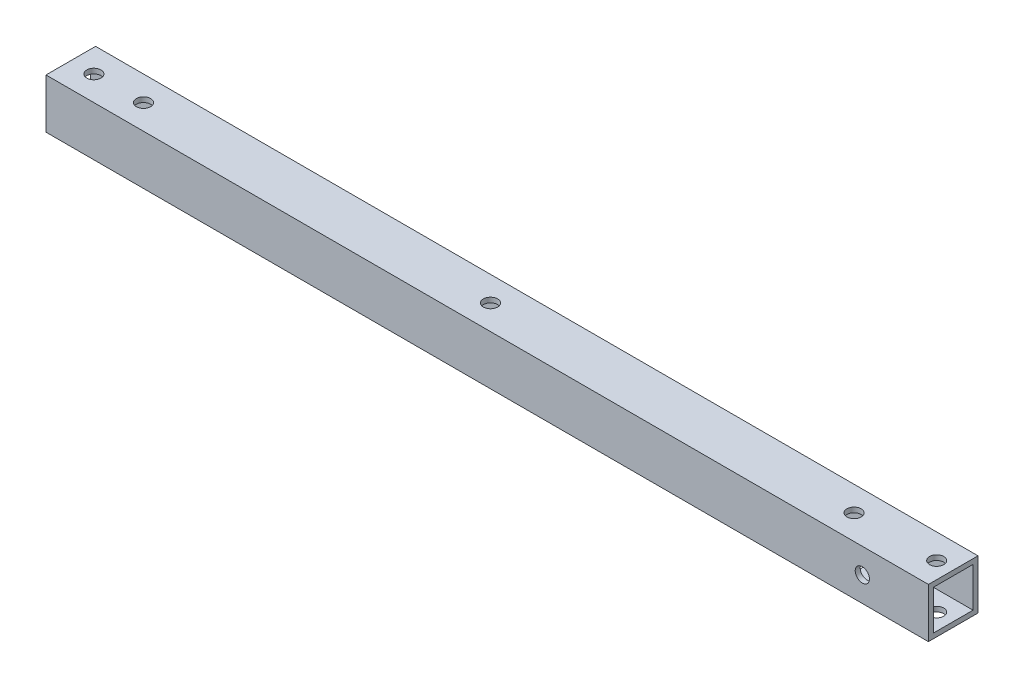
ISO-10303-21;
HEADER;
FILE_DESCRIPTION(('STEP AP214'),'2;1');
FILE_NAME('part.step','',(''),(''),'','','');
FILE_SCHEMA(('AUTOMOTIVE_DESIGN { 1 0 10303 214 1 1 1 1 }'));
ENDSEC;
DATA;
#1=APPLICATION_CONTEXT('core data for automotive mechanical design processes');
#2=APPLICATION_PROTOCOL_DEFINITION('international standard','automotive_design',2000,#1);
#3=PRODUCT_CONTEXT('',#1,'mechanical');
#4=PRODUCT('Part','Part','',(#3));
#5=PRODUCT_RELATED_PRODUCT_CATEGORY('part','',(#4));
#6=PRODUCT_DEFINITION_FORMATION('','',#4);
#7=PRODUCT_DEFINITION_CONTEXT('part definition',#1,'design');
#8=PRODUCT_DEFINITION('design','',#6,#7);
#9=PRODUCT_DEFINITION_SHAPE('','',#8);
#10=(LENGTH_UNIT() NAMED_UNIT(*) SI_UNIT(.MILLI.,.METRE.));
#11=(NAMED_UNIT(*) PLANE_ANGLE_UNIT() SI_UNIT($,.RADIAN.));
#12=(NAMED_UNIT(*) SI_UNIT($,.STERADIAN.) SOLID_ANGLE_UNIT());
#13=UNCERTAINTY_MEASURE_WITH_UNIT(LENGTH_MEASURE(1.E-05),#10,'distance_accuracy_value','');
#14=(GEOMETRIC_REPRESENTATION_CONTEXT(3) GLOBAL_UNCERTAINTY_ASSIGNED_CONTEXT((#13)) GLOBAL_UNIT_ASSIGNED_CONTEXT((#10,
#11,#12)) REPRESENTATION_CONTEXT('',''));
#15=CARTESIAN_POINT('',(0.,0.,0.));
#16=DIRECTION('',(0.,0.,1.));
#17=DIRECTION('',(1.,0.,0.));
#18=AXIS2_PLACEMENT_3D('',#15,#16,#17);
#19=CARTESIAN_POINT('',(267.,0.,0.));
#20=DIRECTION('',(1.,0.,0.));
#21=DIRECTION('',(0.,0.,-1.));
#22=AXIS2_PLACEMENT_3D('',#19,#20,#21);
#23=PLANE('',#22);
#24=DIRECTION('',(0.,1.,0.));
#25=VECTOR('',#24,1.);
#26=CARTESIAN_POINT('',(267.,7.5,-7.5));
#27=LINE('',#26,#25);
#28=CARTESIAN_POINT('',(267.,-7.5,-7.5));
#29=VERTEX_POINT('',#28);
#30=CARTESIAN_POINT('',(267.,7.5,-7.5));
#31=VERTEX_POINT('',#30);
#32=EDGE_CURVE('E162',#29,#31,#27,.T.);
#33=ORIENTED_EDGE('',*,*,#32,.T.);
#34=DIRECTION('',(0.,0.,1.));
#35=VECTOR('',#34,1.);
#36=CARTESIAN_POINT('',(267.,7.5,7.5));
#37=LINE('',#36,#35);
#38=CARTESIAN_POINT('',(267.,7.5,7.5));
#39=VERTEX_POINT('',#38);
#40=EDGE_CURVE('E165',#31,#39,#37,.T.);
#41=ORIENTED_EDGE('',*,*,#40,.T.);
#42=DIRECTION('',(0.,-1.,0.));
#43=VECTOR('',#42,1.);
#44=CARTESIAN_POINT('',(267.,7.5,7.5));
#45=LINE('',#44,#43);
#46=CARTESIAN_POINT('',(267.,-7.5,7.5));
#47=VERTEX_POINT('',#46);
#48=EDGE_CURVE('E168',#39,#47,#45,.T.);
#49=ORIENTED_EDGE('',*,*,#48,.T.);
#50=DIRECTION('',(0.,0.,-1.));
#51=VECTOR('',#50,1.);
#52=CARTESIAN_POINT('',(267.,-7.5,7.5));
#53=LINE('',#52,#51);
#54=EDGE_CURVE('E170',#47,#29,#53,.T.);
#55=ORIENTED_EDGE('',*,*,#54,.T.);
#56=EDGE_LOOP('',(#33,#41,#49,#55));
#57=FACE_BOUND('',#56,.T.);
#58=DIRECTION('',(0.,0.,1.));
#59=VECTOR('',#58,1.);
#60=CARTESIAN_POINT('',(267.,6.,7.5));
#61=LINE('',#60,#59);
#62=CARTESIAN_POINT('',(267.,6.,-6.));
#63=VERTEX_POINT('',#62);
#64=CARTESIAN_POINT('',(267.,6.,6.));
#65=VERTEX_POINT('',#64);
#66=EDGE_CURVE('E132',#63,#65,#61,.T.);
#67=ORIENTED_EDGE('',*,*,#66,.F.);
#68=DIRECTION('',(0.,1.,0.));
#69=VECTOR('',#68,1.);
#70=CARTESIAN_POINT('',(267.,7.5,-6.));
#71=LINE('',#70,#69);
#72=CARTESIAN_POINT('',(267.,-6.,-6.));
#73=VERTEX_POINT('',#72);
#74=EDGE_CURVE('E124',#73,#63,#71,.T.);
#75=ORIENTED_EDGE('',*,*,#74,.F.);
#76=DIRECTION('',(0.,0.,-1.));
#77=VECTOR('',#76,1.);
#78=CARTESIAN_POINT('',(267.,-6.,7.5));
#79=LINE('',#78,#77);
#80=CARTESIAN_POINT('',(267.,-6.,6.));
#81=VERTEX_POINT('',#80);
#82=EDGE_CURVE('E146',#81,#73,#79,.T.);
#83=ORIENTED_EDGE('',*,*,#82,.F.);
#84=DIRECTION('',(0.,-1.,0.));
#85=VECTOR('',#84,1.);
#86=CARTESIAN_POINT('',(267.,7.5,6.));
#87=LINE('',#86,#85);
#88=EDGE_CURVE('E144',#65,#81,#87,.T.);
#89=ORIENTED_EDGE('',*,*,#88,.F.);
#90=EDGE_LOOP('',(#67,#75,#83,#89));
#91=FACE_BOUND('',#90,.T.);
#92=ADVANCED_FACE('F57',(#57,#91),#23,.T.);
#93=CARTESIAN_POINT('',(0.,0.,0.));
#94=DIRECTION('',(1.,0.,0.));
#95=DIRECTION('',(0.,0.,-1.));
#96=AXIS2_PLACEMENT_3D('',#93,#94,#95);
#97=PLANE('',#96);
#98=DIRECTION('',(0.,1.,0.));
#99=VECTOR('',#98,1.);
#100=CARTESIAN_POINT('',(0.,7.5,-7.5));
#101=LINE('',#100,#99);
#102=CARTESIAN_POINT('',(0.,-7.5,-7.5));
#103=VERTEX_POINT('',#102);
#104=CARTESIAN_POINT('',(0.,7.5,-7.5));
#105=VERTEX_POINT('',#104);
#106=EDGE_CURVE('E140',#103,#105,#101,.T.);
#107=ORIENTED_EDGE('',*,*,#106,.F.);
#108=DIRECTION('',(0.,0.,-1.));
#109=VECTOR('',#108,1.);
#110=CARTESIAN_POINT('',(0.,-7.5,7.5));
#111=LINE('',#110,#109);
#112=CARTESIAN_POINT('',(0.,-7.5,7.5));
#113=VERTEX_POINT('',#112);
#114=EDGE_CURVE('E166',#113,#103,#111,.T.);
#115=ORIENTED_EDGE('',*,*,#114,.F.);
#116=DIRECTION('',(0.,-1.,0.));
#117=VECTOR('',#116,1.);
#118=CARTESIAN_POINT('',(0.,7.5,7.5));
#119=LINE('',#118,#117);
#120=CARTESIAN_POINT('',(0.,7.5,7.5));
#121=VERTEX_POINT('',#120);
#122=EDGE_CURVE('E177',#121,#113,#119,.T.);
#123=ORIENTED_EDGE('',*,*,#122,.F.);
#124=DIRECTION('',(0.,0.,1.));
#125=VECTOR('',#124,1.);
#126=CARTESIAN_POINT('',(0.,7.5,7.5));
#127=LINE('',#126,#125);
#128=EDGE_CURVE('E175',#105,#121,#127,.T.);
#129=ORIENTED_EDGE('',*,*,#128,.F.);
#130=EDGE_LOOP('',(#107,#115,#123,#129));
#131=FACE_BOUND('',#130,.T.);
#132=DIRECTION('',(0.,1.,0.));
#133=VECTOR('',#132,1.);
#134=CARTESIAN_POINT('',(0.,7.5,-6.));
#135=LINE('',#134,#133);
#136=CARTESIAN_POINT('',(0.,-6.,-6.));
#137=VERTEX_POINT('',#136);
#138=CARTESIAN_POINT('',(0.,6.,-6.));
#139=VERTEX_POINT('',#138);
#140=EDGE_CURVE('E82',#137,#139,#135,.T.);
#141=ORIENTED_EDGE('',*,*,#140,.T.);
#142=DIRECTION('',(0.,0.,1.));
#143=VECTOR('',#142,1.);
#144=CARTESIAN_POINT('',(0.,6.,7.5));
#145=LINE('',#144,#143);
#146=CARTESIAN_POINT('',(0.,6.,6.));
#147=VERTEX_POINT('',#146);
#148=EDGE_CURVE('E139',#139,#147,#145,.T.);
#149=ORIENTED_EDGE('',*,*,#148,.T.);
#150=DIRECTION('',(0.,-1.,0.));
#151=VECTOR('',#150,1.);
#152=CARTESIAN_POINT('',(0.,7.5,6.));
#153=LINE('',#152,#151);
#154=CARTESIAN_POINT('',(0.,-6.,6.));
#155=VERTEX_POINT('',#154);
#156=EDGE_CURVE('E154',#147,#155,#153,.T.);
#157=ORIENTED_EDGE('',*,*,#156,.T.);
#158=DIRECTION('',(0.,0.,-1.));
#159=VECTOR('',#158,1.);
#160=CARTESIAN_POINT('',(0.,-6.,7.5));
#161=LINE('',#160,#159);
#162=EDGE_CURVE('E133',#155,#137,#161,.T.);
#163=ORIENTED_EDGE('',*,*,#162,.T.);
#164=EDGE_LOOP('',(#141,#149,#157,#163));
#165=FACE_BOUND('',#164,.T.);
#166=ADVANCED_FACE('F271',(#131,#165),#97,.F.);
#167=CARTESIAN_POINT('',(267.,7.5,-7.5));
#168=DIRECTION('',(0.,0.,1.));
#169=DIRECTION('',(0.,-1.,0.));
#170=AXIS2_PLACEMENT_3D('',#167,#168,#169);
#171=PLANE('',#170);
#172=CARTESIAN_POINT('',(247.,0.,-7.5));
#173=DIRECTION('',(0.,0.,1.));
#174=DIRECTION('',(1.,0.,0.));
#175=AXIS2_PLACEMENT_3D('',#172,#173,#174);
#176=CIRCLE('',#175,2.15000000000002);
#177=CARTESIAN_POINT('',(249.15,0.,-7.5));
#178=VERTEX_POINT('',#177);
#179=EDGE_CURVE('E254',#178,#178,#176,.T.);
#180=ORIENTED_EDGE('',*,*,#179,.T.);
#181=EDGE_LOOP('',(#180));
#182=FACE_BOUND('',#181,.T.);
#183=ORIENTED_EDGE('',*,*,#106,.T.);
#184=DIRECTION('',(-1.,0.,0.));
#185=VECTOR('',#184,1.);
#186=CARTESIAN_POINT('',(267.,7.5,-7.5));
#187=LINE('',#186,#185);
#188=EDGE_CURVE('E12',#31,#105,#187,.T.);
#189=ORIENTED_EDGE('',*,*,#188,.F.);
#190=ORIENTED_EDGE('',*,*,#32,.F.);
#191=DIRECTION('',(-1.,0.,0.));
#192=VECTOR('',#191,1.);
#193=CARTESIAN_POINT('',(267.,-7.5,-7.5));
#194=LINE('',#193,#192);
#195=EDGE_CURVE('E172',#29,#103,#194,.T.);
#196=ORIENTED_EDGE('',*,*,#195,.T.);
#197=EDGE_LOOP('',(#183,#189,#190,#196));
#198=FACE_BOUND('',#197,.T.);
#199=ADVANCED_FACE('F59',(#182,#198),#171,.F.);
#200=CARTESIAN_POINT('',(267.,7.5,7.5));
#201=DIRECTION('',(0.,-1.,0.));
#202=DIRECTION('',(0.,0.,-1.));
#203=AXIS2_PLACEMENT_3D('',#200,#201,#202);
#204=PLANE('',#203);
#205=CARTESIAN_POINT('',(262.,7.5,0.));
#206=DIRECTION('',(0.,1.,0.));
#207=DIRECTION('',(0.,0.,1.));
#208=AXIS2_PLACEMENT_3D('',#205,#206,#207);
#209=CIRCLE('',#208,2.15000000000002);
#210=CARTESIAN_POINT('',(262.,7.5,2.15000000000002));
#211=VERTEX_POINT('',#210);
#212=EDGE_CURVE('E244',#211,#211,#209,.T.);
#213=ORIENTED_EDGE('',*,*,#212,.F.);
#214=EDGE_LOOP('',(#213));
#215=FACE_BOUND('',#214,.T.);
#216=CARTESIAN_POINT('',(22.,7.5,0.));
#217=DIRECTION('',(0.,1.,0.));
#218=DIRECTION('',(0.,0.,1.));
#219=AXIS2_PLACEMENT_3D('',#216,#217,#218);
#220=CIRCLE('',#219,2.15);
#221=CARTESIAN_POINT('',(22.,7.5,2.15));
#222=VERTEX_POINT('',#221);
#223=EDGE_CURVE('E238',#222,#222,#220,.T.);
#224=ORIENTED_EDGE('',*,*,#223,.F.);
#225=EDGE_LOOP('',(#224));
#226=FACE_BOUND('',#225,.T.);
#227=CARTESIAN_POINT('',(7.,7.5,0.));
#228=DIRECTION('',(0.,1.,0.));
#229=DIRECTION('',(0.,0.,1.));
#230=AXIS2_PLACEMENT_3D('',#227,#228,#229);
#231=CIRCLE('',#230,2.15);
#232=CARTESIAN_POINT('',(7.,7.5,2.15));
#233=VERTEX_POINT('',#232);
#234=EDGE_CURVE('E232',#233,#233,#231,.T.);
#235=ORIENTED_EDGE('',*,*,#234,.F.);
#236=EDGE_LOOP('',(#235));
#237=FACE_BOUND('',#236,.T.);
#238=CARTESIAN_POINT('',(237.,7.5,0.));
#239=DIRECTION('',(0.,1.,0.));
#240=DIRECTION('',(0.,0.,1.));
#241=AXIS2_PLACEMENT_3D('',#238,#239,#240);
#242=CIRCLE('',#241,2.15000000000002);
#243=CARTESIAN_POINT('',(237.,7.5,2.15000000000002));
#244=VERTEX_POINT('',#243);
#245=EDGE_CURVE('E226',#244,#244,#242,.T.);
#246=ORIENTED_EDGE('',*,*,#245,.F.);
#247=EDGE_LOOP('',(#246));
#248=FACE_BOUND('',#247,.T.);
#249=CARTESIAN_POINT('',(127.,7.5,0.));
#250=DIRECTION('',(0.,1.,0.));
#251=DIRECTION('',(0.,0.,-1.));
#252=AXIS2_PLACEMENT_3D('',#249,#250,#251);
#253=CIRCLE('',#252,2.15000000000002);
#254=CARTESIAN_POINT('',(127.,7.5,-2.15000000000002));
#255=VERTEX_POINT('',#254);
#256=EDGE_CURVE('E219',#255,#255,#253,.T.);
#257=ORIENTED_EDGE('',*,*,#256,.F.);
#258=EDGE_LOOP('',(#257));
#259=FACE_BOUND('',#258,.T.);
#260=ORIENTED_EDGE('',*,*,#128,.T.);
#261=DIRECTION('',(-1.,0.,0.));
#262=VECTOR('',#261,1.);
#263=CARTESIAN_POINT('',(267.,7.5,7.5));
#264=LINE('',#263,#262);
#265=EDGE_CURVE('E66',#39,#121,#264,.T.);
#266=ORIENTED_EDGE('',*,*,#265,.F.);
#267=ORIENTED_EDGE('',*,*,#40,.F.);
#268=ORIENTED_EDGE('',*,*,#188,.T.);
#269=EDGE_LOOP('',(#260,#266,#267,#268));
#270=FACE_BOUND('',#269,.T.);
#271=ADVANCED_FACE('F301',(#215,#226,#237,#248,#259,#270),#204,.F.);
#272=CARTESIAN_POINT('',(267.,7.5,7.5));
#273=DIRECTION('',(0.,0.,-1.));
#274=DIRECTION('',(0.,1.,0.));
#275=AXIS2_PLACEMENT_3D('',#272,#273,#274);
#276=PLANE('',#275);
#277=CARTESIAN_POINT('',(247.,0.,7.5));
#278=DIRECTION('',(0.,0.,1.));
#279=DIRECTION('',(1.,0.,0.));
#280=AXIS2_PLACEMENT_3D('',#277,#278,#279);
#281=CIRCLE('',#280,2.15000000000002);
#282=CARTESIAN_POINT('',(249.15,0.,7.5));
#283=VERTEX_POINT('',#282);
#284=EDGE_CURVE('E251',#283,#283,#281,.T.);
#285=ORIENTED_EDGE('',*,*,#284,.F.);
#286=EDGE_LOOP('',(#285));
#287=FACE_BOUND('',#286,.T.);
#288=ORIENTED_EDGE('',*,*,#122,.T.);
#289=DIRECTION('',(-1.,0.,0.));
#290=VECTOR('',#289,1.);
#291=CARTESIAN_POINT('',(267.,-7.5,7.5));
#292=LINE('',#291,#290);
#293=EDGE_CURVE('E182',#47,#113,#292,.T.);
#294=ORIENTED_EDGE('',*,*,#293,.F.);
#295=ORIENTED_EDGE('',*,*,#48,.F.);
#296=ORIENTED_EDGE('',*,*,#265,.T.);
#297=EDGE_LOOP('',(#288,#294,#295,#296));
#298=FACE_BOUND('',#297,.T.);
#299=ADVANCED_FACE('F298',(#287,#298),#276,.F.);
#300=CARTESIAN_POINT('',(267.,-7.5,7.5));
#301=DIRECTION('',(0.,1.,0.));
#302=DIRECTION('',(0.,0.,1.));
#303=AXIS2_PLACEMENT_3D('',#300,#301,#302);
#304=PLANE('',#303);
#305=CARTESIAN_POINT('',(262.,-7.5,0.));
#306=DIRECTION('',(0.,1.,0.));
#307=DIRECTION('',(0.,0.,1.));
#308=AXIS2_PLACEMENT_3D('',#305,#306,#307);
#309=CIRCLE('',#308,2.15000000000002);
#310=CARTESIAN_POINT('',(262.,-7.5,2.15000000000002));
#311=VERTEX_POINT('',#310);
#312=EDGE_CURVE('E191',#311,#311,#309,.T.);
#313=ORIENTED_EDGE('',*,*,#312,.T.);
#314=EDGE_LOOP('',(#313));
#315=FACE_BOUND('',#314,.T.);
#316=CARTESIAN_POINT('',(22.,-7.5,0.));
#317=DIRECTION('',(0.,1.,0.));
#318=DIRECTION('',(0.,0.,1.));
#319=AXIS2_PLACEMENT_3D('',#316,#317,#318);
#320=CIRCLE('',#319,2.15);
#321=CARTESIAN_POINT('',(22.,-7.5,2.15));
#322=VERTEX_POINT('',#321);
#323=EDGE_CURVE('E241',#322,#322,#320,.T.);
#324=ORIENTED_EDGE('',*,*,#323,.T.);
#325=EDGE_LOOP('',(#324));
#326=FACE_BOUND('',#325,.T.);
#327=CARTESIAN_POINT('',(7.,-7.5,0.));
#328=DIRECTION('',(0.,1.,0.));
#329=DIRECTION('',(0.,0.,1.));
#330=AXIS2_PLACEMENT_3D('',#327,#328,#329);
#331=CIRCLE('',#330,2.15);
#332=CARTESIAN_POINT('',(7.,-7.5,2.15));
#333=VERTEX_POINT('',#332);
#334=EDGE_CURVE('E235',#333,#333,#331,.T.);
#335=ORIENTED_EDGE('',*,*,#334,.T.);
#336=EDGE_LOOP('',(#335));
#337=FACE_BOUND('',#336,.T.);
#338=CARTESIAN_POINT('',(237.,-7.5,0.));
#339=DIRECTION('',(0.,1.,0.));
#340=DIRECTION('',(0.,0.,1.));
#341=AXIS2_PLACEMENT_3D('',#338,#339,#340);
#342=CIRCLE('',#341,2.15000000000002);
#343=CARTESIAN_POINT('',(237.,-7.5,2.15000000000002));
#344=VERTEX_POINT('',#343);
#345=EDGE_CURVE('E229',#344,#344,#342,.T.);
#346=ORIENTED_EDGE('',*,*,#345,.T.);
#347=EDGE_LOOP('',(#346));
#348=FACE_BOUND('',#347,.T.);
#349=CARTESIAN_POINT('',(127.,-7.5,0.));
#350=DIRECTION('',(0.,1.,0.));
#351=DIRECTION('',(0.,0.,-1.));
#352=AXIS2_PLACEMENT_3D('',#349,#350,#351);
#353=CIRCLE('',#352,2.15000000000002);
#354=CARTESIAN_POINT('',(127.,-7.5,-2.15000000000002));
#355=VERTEX_POINT('',#354);
#356=EDGE_CURVE('E222',#355,#355,#353,.T.);
#357=ORIENTED_EDGE('',*,*,#356,.T.);
#358=EDGE_LOOP('',(#357));
#359=FACE_BOUND('',#358,.T.);
#360=ORIENTED_EDGE('',*,*,#114,.T.);
#361=ORIENTED_EDGE('',*,*,#195,.F.);
#362=ORIENTED_EDGE('',*,*,#54,.F.);
#363=ORIENTED_EDGE('',*,*,#293,.T.);
#364=EDGE_LOOP('',(#360,#361,#362,#363));
#365=FACE_BOUND('',#364,.T.);
#366=ADVANCED_FACE('F295',(#315,#326,#337,#348,#359,#365),#304,.F.);
#367=CARTESIAN_POINT('',(267.,7.5,-6.));
#368=DIRECTION('',(0.,0.,1.));
#369=DIRECTION('',(0.,-1.,0.));
#370=AXIS2_PLACEMENT_3D('',#367,#368,#369);
#371=PLANE('',#370);
#372=CARTESIAN_POINT('',(247.,0.,-6.));
#373=DIRECTION('',(0.,0.,1.));
#374=DIRECTION('',(0.,-1.,0.));
#375=AXIS2_PLACEMENT_3D('',#372,#373,#374);
#376=CIRCLE('',#375,2.15000000000002);
#377=CARTESIAN_POINT('',(247.,-2.15000000000002,-6.));
#378=VERTEX_POINT('',#377);
#379=EDGE_CURVE('E223',#378,#378,#376,.T.);
#380=ORIENTED_EDGE('',*,*,#379,.F.);
#381=EDGE_LOOP('',(#380));
#382=FACE_BOUND('',#381,.T.);
#383=ORIENTED_EDGE('',*,*,#140,.F.);
#384=DIRECTION('',(-1.,0.,0.));
#385=VECTOR('',#384,1.);
#386=CARTESIAN_POINT('',(267.,-6.,-6.));
#387=LINE('',#386,#385);
#388=EDGE_CURVE('E128',#73,#137,#387,.T.);
#389=ORIENTED_EDGE('',*,*,#388,.F.);
#390=ORIENTED_EDGE('',*,*,#74,.T.);
#391=DIRECTION('',(-1.,0.,0.));
#392=VECTOR('',#391,1.);
#393=CARTESIAN_POINT('',(267.,6.,-6.));
#394=LINE('',#393,#392);
#395=EDGE_CURVE('E127',#63,#139,#394,.T.);
#396=ORIENTED_EDGE('',*,*,#395,.T.);
#397=EDGE_LOOP('',(#383,#389,#390,#396));
#398=FACE_BOUND('',#397,.T.);
#399=ADVANCED_FACE('F126',(#382,#398),#371,.T.);
#400=CARTESIAN_POINT('',(267.,6.,7.5));
#401=DIRECTION('',(0.,-1.,0.));
#402=DIRECTION('',(0.,0.,-1.));
#403=AXIS2_PLACEMENT_3D('',#400,#401,#402);
#404=PLANE('',#403);
#405=CARTESIAN_POINT('',(262.,6.,0.));
#406=DIRECTION('',(0.,-1.,0.));
#407=DIRECTION('',(0.,0.,-1.));
#408=AXIS2_PLACEMENT_3D('',#405,#406,#407);
#409=CIRCLE('',#408,2.15000000000002);
#410=CARTESIAN_POINT('',(262.,6.,-2.15000000000002));
#411=VERTEX_POINT('',#410);
#412=EDGE_CURVE('E152',#411,#411,#409,.T.);
#413=ORIENTED_EDGE('',*,*,#412,.F.);
#414=EDGE_LOOP('',(#413));
#415=FACE_BOUND('',#414,.T.);
#416=CARTESIAN_POINT('',(22.,6.,0.));
#417=DIRECTION('',(0.,-1.,0.));
#418=DIRECTION('',(0.,0.,-1.));
#419=AXIS2_PLACEMENT_3D('',#416,#417,#418);
#420=CIRCLE('',#419,2.15);
#421=CARTESIAN_POINT('',(22.,6.,-2.15));
#422=VERTEX_POINT('',#421);
#423=EDGE_CURVE('E202',#422,#422,#420,.T.);
#424=ORIENTED_EDGE('',*,*,#423,.F.);
#425=EDGE_LOOP('',(#424));
#426=FACE_BOUND('',#425,.T.);
#427=CARTESIAN_POINT('',(7.,6.,0.));
#428=DIRECTION('',(0.,-1.,0.));
#429=DIRECTION('',(0.,0.,-1.));
#430=AXIS2_PLACEMENT_3D('',#427,#428,#429);
#431=CIRCLE('',#430,2.15);
#432=CARTESIAN_POINT('',(7.,6.,-2.15));
#433=VERTEX_POINT('',#432);
#434=EDGE_CURVE('E199',#433,#433,#431,.T.);
#435=ORIENTED_EDGE('',*,*,#434,.F.);
#436=EDGE_LOOP('',(#435));
#437=FACE_BOUND('',#436,.T.);
#438=CARTESIAN_POINT('',(237.,6.,0.));
#439=DIRECTION('',(0.,-1.,0.));
#440=DIRECTION('',(0.,0.,-1.));
#441=AXIS2_PLACEMENT_3D('',#438,#439,#440);
#442=CIRCLE('',#441,2.15000000000002);
#443=CARTESIAN_POINT('',(237.,6.,-2.15000000000002));
#444=VERTEX_POINT('',#443);
#445=EDGE_CURVE('E195',#444,#444,#442,.T.);
#446=ORIENTED_EDGE('',*,*,#445,.F.);
#447=EDGE_LOOP('',(#446));
#448=FACE_BOUND('',#447,.T.);
#449=CARTESIAN_POINT('',(127.,6.,0.));
#450=DIRECTION('',(0.,-1.,0.));
#451=DIRECTION('',(0.,0.,-1.));
#452=AXIS2_PLACEMENT_3D('',#449,#450,#451);
#453=CIRCLE('',#452,2.15000000000002);
#454=CARTESIAN_POINT('',(127.,6.,-2.15000000000002));
#455=VERTEX_POINT('',#454);
#456=EDGE_CURVE('E190',#455,#455,#453,.T.);
#457=ORIENTED_EDGE('',*,*,#456,.F.);
#458=EDGE_LOOP('',(#457));
#459=FACE_BOUND('',#458,.T.);
#460=ORIENTED_EDGE('',*,*,#148,.F.);
#461=ORIENTED_EDGE('',*,*,#395,.F.);
#462=ORIENTED_EDGE('',*,*,#66,.T.);
#463=DIRECTION('',(-1.,0.,0.));
#464=VECTOR('',#463,1.);
#465=CARTESIAN_POINT('',(267.,6.,6.));
#466=LINE('',#465,#464);
#467=EDGE_CURVE('E141',#65,#147,#466,.T.);
#468=ORIENTED_EDGE('',*,*,#467,.T.);
#469=EDGE_LOOP('',(#460,#461,#462,#468));
#470=FACE_BOUND('',#469,.T.);
#471=ADVANCED_FACE('F136',(#415,#426,#437,#448,#459,#470),#404,.T.);
#472=CARTESIAN_POINT('',(267.,7.5,6.));
#473=DIRECTION('',(0.,0.,-1.));
#474=DIRECTION('',(0.,1.,0.));
#475=AXIS2_PLACEMENT_3D('',#472,#473,#474);
#476=PLANE('',#475);
#477=CARTESIAN_POINT('',(247.,0.,6.));
#478=DIRECTION('',(0.,0.,-1.));
#479=DIRECTION('',(0.,1.,0.));
#480=AXIS2_PLACEMENT_3D('',#477,#478,#479);
#481=CIRCLE('',#480,2.15000000000002);
#482=CARTESIAN_POINT('',(247.,2.15000000000001,6.));
#483=VERTEX_POINT('',#482);
#484=EDGE_CURVE('E61',#483,#483,#481,.T.);
#485=ORIENTED_EDGE('',*,*,#484,.F.);
#486=EDGE_LOOP('',(#485));
#487=FACE_BOUND('',#486,.T.);
#488=ORIENTED_EDGE('',*,*,#156,.F.);
#489=ORIENTED_EDGE('',*,*,#467,.F.);
#490=ORIENTED_EDGE('',*,*,#88,.T.);
#491=DIRECTION('',(-1.,0.,0.));
#492=VECTOR('',#491,1.);
#493=CARTESIAN_POINT('',(267.,-6.,6.));
#494=LINE('',#493,#492);
#495=EDGE_CURVE('E74',#81,#155,#494,.T.);
#496=ORIENTED_EDGE('',*,*,#495,.T.);
#497=EDGE_LOOP('',(#488,#489,#490,#496));
#498=FACE_BOUND('',#497,.T.);
#499=ADVANCED_FACE('F264',(#487,#498),#476,.T.);
#500=CARTESIAN_POINT('',(267.,-6.,7.5));
#501=DIRECTION('',(0.,1.,0.));
#502=DIRECTION('',(0.,0.,1.));
#503=AXIS2_PLACEMENT_3D('',#500,#501,#502);
#504=PLANE('',#503);
#505=CARTESIAN_POINT('',(262.,-6.,0.));
#506=DIRECTION('',(0.,1.,0.));
#507=DIRECTION('',(0.,0.,1.));
#508=AXIS2_PLACEMENT_3D('',#505,#506,#507);
#509=CIRCLE('',#508,2.15000000000002);
#510=CARTESIAN_POINT('',(262.,-6.,2.15000000000002));
#511=VERTEX_POINT('',#510);
#512=EDGE_CURVE('E203',#511,#511,#509,.T.);
#513=ORIENTED_EDGE('',*,*,#512,.F.);
#514=EDGE_LOOP('',(#513));
#515=FACE_BOUND('',#514,.T.);
#516=CARTESIAN_POINT('',(22.,-6.,0.));
#517=DIRECTION('',(0.,1.,0.));
#518=DIRECTION('',(0.,0.,1.));
#519=AXIS2_PLACEMENT_3D('',#516,#517,#518);
#520=CIRCLE('',#519,2.15);
#521=CARTESIAN_POINT('',(22.,-6.,2.15));
#522=VERTEX_POINT('',#521);
#523=EDGE_CURVE('E200',#522,#522,#520,.T.);
#524=ORIENTED_EDGE('',*,*,#523,.F.);
#525=EDGE_LOOP('',(#524));
#526=FACE_BOUND('',#525,.T.);
#527=CARTESIAN_POINT('',(7.,-6.,0.));
#528=DIRECTION('',(0.,1.,0.));
#529=DIRECTION('',(0.,0.,1.));
#530=AXIS2_PLACEMENT_3D('',#527,#528,#529);
#531=CIRCLE('',#530,2.15);
#532=CARTESIAN_POINT('',(7.,-6.,2.15));
#533=VERTEX_POINT('',#532);
#534=EDGE_CURVE('E196',#533,#533,#531,.T.);
#535=ORIENTED_EDGE('',*,*,#534,.F.);
#536=EDGE_LOOP('',(#535));
#537=FACE_BOUND('',#536,.T.);
#538=CARTESIAN_POINT('',(237.,-6.,0.));
#539=DIRECTION('',(0.,1.,0.));
#540=DIRECTION('',(0.,0.,1.));
#541=AXIS2_PLACEMENT_3D('',#538,#539,#540);
#542=CIRCLE('',#541,2.15000000000002);
#543=CARTESIAN_POINT('',(237.,-6.,2.15000000000002));
#544=VERTEX_POINT('',#543);
#545=EDGE_CURVE('E192',#544,#544,#542,.T.);
#546=ORIENTED_EDGE('',*,*,#545,.F.);
#547=EDGE_LOOP('',(#546));
#548=FACE_BOUND('',#547,.T.);
#549=CARTESIAN_POINT('',(127.,-6.,0.));
#550=DIRECTION('',(0.,1.,0.));
#551=DIRECTION('',(0.,0.,1.));
#552=AXIS2_PLACEMENT_3D('',#549,#550,#551);
#553=CIRCLE('',#552,2.15000000000002);
#554=CARTESIAN_POINT('',(127.,-6.,2.15000000000002));
#555=VERTEX_POINT('',#554);
#556=EDGE_CURVE('E187',#555,#555,#553,.T.);
#557=ORIENTED_EDGE('',*,*,#556,.F.);
#558=EDGE_LOOP('',(#557));
#559=FACE_BOUND('',#558,.T.);
#560=ORIENTED_EDGE('',*,*,#162,.F.);
#561=ORIENTED_EDGE('',*,*,#495,.F.);
#562=ORIENTED_EDGE('',*,*,#82,.T.);
#563=ORIENTED_EDGE('',*,*,#388,.T.);
#564=EDGE_LOOP('',(#560,#561,#562,#563));
#565=FACE_BOUND('',#564,.T.);
#566=ADVANCED_FACE('F267',(#515,#526,#537,#548,#559,#565),#504,.T.);
#567=CARTESIAN_POINT('',(127.,-7.5,0.));
#568=DIRECTION('',(0.,1.,0.));
#569=DIRECTION('',(0.,0.,1.));
#570=AXIS2_PLACEMENT_3D('',#567,#568,#569);
#571=CYLINDRICAL_SURFACE('',#570,2.15000000000002);
#572=ORIENTED_EDGE('',*,*,#556,.T.);
#573=EDGE_LOOP('',(#572));
#574=FACE_BOUND('',#573,.T.);
#575=ORIENTED_EDGE('',*,*,#356,.F.);
#576=EDGE_LOOP('',(#575));
#577=FACE_BOUND('',#576,.T.);
#578=ADVANCED_FACE('F273',(#574,#577),#571,.F.);
#579=CARTESIAN_POINT('',(237.,-7.5,0.));
#580=DIRECTION('',(0.,1.,0.));
#581=DIRECTION('',(0.,0.,1.));
#582=AXIS2_PLACEMENT_3D('',#579,#580,#581);
#583=CYLINDRICAL_SURFACE('',#582,2.15000000000002);
#584=ORIENTED_EDGE('',*,*,#545,.T.);
#585=EDGE_LOOP('',(#584));
#586=FACE_BOUND('',#585,.T.);
#587=ORIENTED_EDGE('',*,*,#345,.F.);
#588=EDGE_LOOP('',(#587));
#589=FACE_BOUND('',#588,.T.);
#590=ADVANCED_FACE('F279',(#586,#589),#583,.F.);
#591=CARTESIAN_POINT('',(7.,-7.5,0.));
#592=DIRECTION('',(0.,1.,0.));
#593=DIRECTION('',(0.,0.,1.));
#594=AXIS2_PLACEMENT_3D('',#591,#592,#593);
#595=CYLINDRICAL_SURFACE('',#594,2.15);
#596=ORIENTED_EDGE('',*,*,#534,.T.);
#597=EDGE_LOOP('',(#596));
#598=FACE_BOUND('',#597,.T.);
#599=ORIENTED_EDGE('',*,*,#334,.F.);
#600=EDGE_LOOP('',(#599));
#601=FACE_BOUND('',#600,.T.);
#602=ADVANCED_FACE('F348',(#598,#601),#595,.F.);
#603=CARTESIAN_POINT('',(22.,-7.5,0.));
#604=DIRECTION('',(0.,1.,0.));
#605=DIRECTION('',(0.,0.,1.));
#606=AXIS2_PLACEMENT_3D('',#603,#604,#605);
#607=CYLINDRICAL_SURFACE('',#606,2.15);
#608=ORIENTED_EDGE('',*,*,#523,.T.);
#609=EDGE_LOOP('',(#608));
#610=FACE_BOUND('',#609,.T.);
#611=ORIENTED_EDGE('',*,*,#323,.F.);
#612=EDGE_LOOP('',(#611));
#613=FACE_BOUND('',#612,.T.);
#614=ADVANCED_FACE('F343',(#610,#613),#607,.F.);
#615=CARTESIAN_POINT('',(262.,-7.5,0.));
#616=DIRECTION('',(0.,1.,0.));
#617=DIRECTION('',(0.,0.,1.));
#618=AXIS2_PLACEMENT_3D('',#615,#616,#617);
#619=CYLINDRICAL_SURFACE('',#618,2.15000000000002);
#620=ORIENTED_EDGE('',*,*,#512,.T.);
#621=EDGE_LOOP('',(#620));
#622=FACE_BOUND('',#621,.T.);
#623=ORIENTED_EDGE('',*,*,#312,.F.);
#624=EDGE_LOOP('',(#623));
#625=FACE_BOUND('',#624,.T.);
#626=ADVANCED_FACE('F334',(#622,#625),#619,.F.);
#627=ORIENTED_EDGE('',*,*,#456,.T.);
#628=EDGE_LOOP('',(#627));
#629=FACE_BOUND('',#628,.T.);
#630=ORIENTED_EDGE('',*,*,#256,.T.);
#631=EDGE_LOOP('',(#630));
#632=FACE_BOUND('',#631,.T.);
#633=ADVANCED_FACE('F282',(#629,#632),#571,.F.);
#634=ORIENTED_EDGE('',*,*,#445,.T.);
#635=EDGE_LOOP('',(#634));
#636=FACE_BOUND('',#635,.T.);
#637=ORIENTED_EDGE('',*,*,#245,.T.);
#638=EDGE_LOOP('',(#637));
#639=FACE_BOUND('',#638,.T.);
#640=ADVANCED_FACE('F333',(#636,#639),#583,.F.);
#641=ORIENTED_EDGE('',*,*,#434,.T.);
#642=EDGE_LOOP('',(#641));
#643=FACE_BOUND('',#642,.T.);
#644=ORIENTED_EDGE('',*,*,#234,.T.);
#645=EDGE_LOOP('',(#644));
#646=FACE_BOUND('',#645,.T.);
#647=ADVANCED_FACE('F340',(#643,#646),#595,.F.);
#648=ORIENTED_EDGE('',*,*,#423,.T.);
#649=EDGE_LOOP('',(#648));
#650=FACE_BOUND('',#649,.T.);
#651=ORIENTED_EDGE('',*,*,#223,.T.);
#652=EDGE_LOOP('',(#651));
#653=FACE_BOUND('',#652,.T.);
#654=ADVANCED_FACE('F355',(#650,#653),#607,.F.);
#655=ORIENTED_EDGE('',*,*,#412,.T.);
#656=EDGE_LOOP('',(#655));
#657=FACE_BOUND('',#656,.T.);
#658=ORIENTED_EDGE('',*,*,#212,.T.);
#659=EDGE_LOOP('',(#658));
#660=FACE_BOUND('',#659,.T.);
#661=ADVANCED_FACE('F345',(#657,#660),#619,.F.);
#662=CARTESIAN_POINT('',(247.,0.,-7.5));
#663=DIRECTION('',(0.,0.,1.));
#664=DIRECTION('',(1.,0.,0.));
#665=AXIS2_PLACEMENT_3D('',#662,#663,#664);
#666=CYLINDRICAL_SURFACE('',#665,2.15000000000002);
#667=ORIENTED_EDGE('',*,*,#484,.T.);
#668=EDGE_LOOP('',(#667));
#669=FACE_BOUND('',#668,.T.);
#670=ORIENTED_EDGE('',*,*,#284,.T.);
#671=EDGE_LOOP('',(#670));
#672=FACE_BOUND('',#671,.T.);
#673=ADVANCED_FACE('F261',(#669,#672),#666,.F.);
#674=ORIENTED_EDGE('',*,*,#379,.T.);
#675=EDGE_LOOP('',(#674));
#676=FACE_BOUND('',#675,.T.);
#677=ORIENTED_EDGE('',*,*,#179,.F.);
#678=EDGE_LOOP('',(#677));
#679=FACE_BOUND('',#678,.T.);
#680=ADVANCED_FACE('F358',(#676,#679),#666,.F.);
#681=CLOSED_SHELL('',(#92,#166,#199,#271,#299,#366,#399,#471,#499,#566,#578,#590,#602,#614,#626,
#633,#640,#647,#654,#661,#673,#680));
#682=MANIFOLD_SOLID_BREP('B2',#681);
#683=ADVANCED_BREP_SHAPE_REPRESENTATION('',(#18,#682),#14);
#684=SHAPE_DEFINITION_REPRESENTATION(#9,#683);
ENDSEC;
END-ISO-10303-21;
